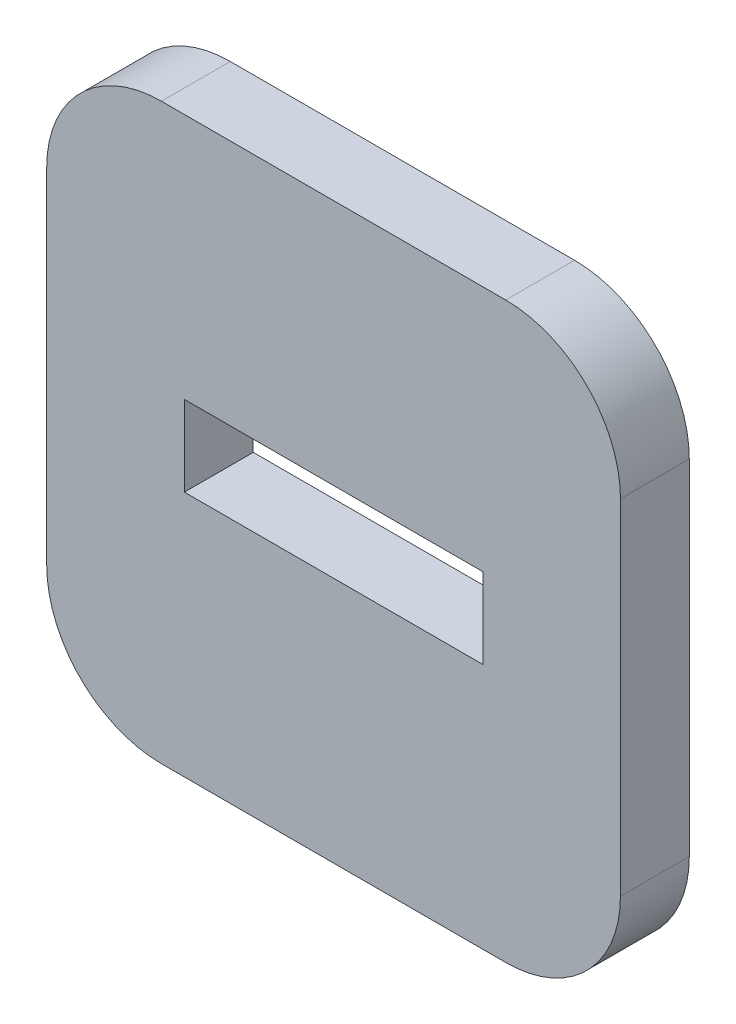
ISO-10303-21;
HEADER;
FILE_DESCRIPTION(('STEP AP214'),'2;1');
FILE_NAME('part.step','',(''),(''),'','','');
FILE_SCHEMA(('AUTOMOTIVE_DESIGN { 1 0 10303 214 1 1 1 1 }'));
ENDSEC;
DATA;
#1=APPLICATION_CONTEXT('core data for automotive mechanical design processes');
#2=APPLICATION_PROTOCOL_DEFINITION('international standard','automotive_design',2000,#1);
#3=PRODUCT_CONTEXT('',#1,'mechanical');
#4=PRODUCT('Part','Part','',(#3));
#5=PRODUCT_RELATED_PRODUCT_CATEGORY('part','',(#4));
#6=PRODUCT_DEFINITION_FORMATION('','',#4);
#7=PRODUCT_DEFINITION_CONTEXT('part definition',#1,'design');
#8=PRODUCT_DEFINITION('design','',#6,#7);
#9=PRODUCT_DEFINITION_SHAPE('','',#8);
#10=(LENGTH_UNIT() NAMED_UNIT(*) SI_UNIT(.MILLI.,.METRE.));
#11=(NAMED_UNIT(*) PLANE_ANGLE_UNIT() SI_UNIT($,.RADIAN.));
#12=(NAMED_UNIT(*) SI_UNIT($,.STERADIAN.) SOLID_ANGLE_UNIT());
#13=UNCERTAINTY_MEASURE_WITH_UNIT(LENGTH_MEASURE(1.E-05),#10,'distance_accuracy_value','');
#14=(GEOMETRIC_REPRESENTATION_CONTEXT(3) GLOBAL_UNCERTAINTY_ASSIGNED_CONTEXT((#13)) GLOBAL_UNIT_ASSIGNED_CONTEXT((#10,
#11,#12)) REPRESENTATION_CONTEXT('',''));
#15=CARTESIAN_POINT('',(0.,0.,0.));
#16=DIRECTION('',(0.,0.,1.));
#17=DIRECTION('',(1.,0.,0.));
#18=AXIS2_PLACEMENT_3D('',#15,#16,#17);
#19=CARTESIAN_POINT('',(-131.108892294877,-12.7,-3.048));
#20=DIRECTION('',(1.,0.,0.));
#21=DIRECTION('',(0.,0.,-1.));
#22=AXIS2_PLACEMENT_3D('',#19,#20,#21);
#23=PLANE('',#22);
#24=DIRECTION('',(0.,1.,0.));
#25=VECTOR('',#24,1.);
#26=CARTESIAN_POINT('',(-131.108892294877,-12.7,-3.048));
#27=LINE('',#26,#25);
#28=CARTESIAN_POINT('',(-131.108892294877,-7.62,-3.048));
#29=VERTEX_POINT('',#28);
#30=CARTESIAN_POINT('',(-131.108892294877,7.62,-3.048));
#31=VERTEX_POINT('',#30);
#32=EDGE_CURVE('E196',#29,#31,#27,.T.);
#33=ORIENTED_EDGE('',*,*,#32,.F.);
#34=DIRECTION('',(0.,0.,1.));
#35=VECTOR('',#34,1.);
#36=CARTESIAN_POINT('',(-131.108892294877,-7.62,0.));
#37=LINE('',#36,#35);
#38=CARTESIAN_POINT('',(-131.108892294877,-7.62,0.));
#39=VERTEX_POINT('',#38);
#40=EDGE_CURVE('E219',#29,#39,#37,.T.);
#41=ORIENTED_EDGE('',*,*,#40,.T.);
#42=DIRECTION('',(0.,1.,0.));
#43=VECTOR('',#42,1.);
#44=CARTESIAN_POINT('',(-131.108892294877,-12.7,0.));
#45=LINE('',#44,#43);
#46=CARTESIAN_POINT('',(-131.108892294877,7.62,0.));
#47=VERTEX_POINT('',#46);
#48=EDGE_CURVE('E192',#39,#47,#45,.T.);
#49=ORIENTED_EDGE('',*,*,#48,.T.);
#50=DIRECTION('',(0.,0.,1.));
#51=VECTOR('',#50,1.);
#52=CARTESIAN_POINT('',(-131.108892294877,7.62,-3.048));
#53=LINE('',#52,#51);
#54=EDGE_CURVE('E207',#47,#31,#53,.F.);
#55=ORIENTED_EDGE('',*,*,#54,.T.);
#56=EDGE_LOOP('',(#33,#41,#49,#55));
#57=FACE_BOUND('',#56,.T.);
#58=ADVANCED_FACE('F63',(#57),#23,.F.);
#59=CARTESIAN_POINT('',(-131.108892294877,12.7,-3.048));
#60=DIRECTION('',(0.,-1.,0.));
#61=DIRECTION('',(0.,0.,-1.));
#62=AXIS2_PLACEMENT_3D('',#59,#60,#61);
#63=PLANE('',#62);
#64=DIRECTION('',(1.,0.,0.));
#65=VECTOR('',#64,1.);
#66=CARTESIAN_POINT('',(-131.108892294877,12.7,0.));
#67=LINE('',#66,#65);
#68=CARTESIAN_POINT('',(-126.028892294877,12.7,0.));
#69=VERTEX_POINT('',#68);
#70=CARTESIAN_POINT('',(-110.788892294877,12.7,0.));
#71=VERTEX_POINT('',#70);
#72=EDGE_CURVE('E210',#69,#71,#67,.T.);
#73=ORIENTED_EDGE('',*,*,#72,.T.);
#74=DIRECTION('',(0.,0.,1.));
#75=VECTOR('',#74,1.);
#76=CARTESIAN_POINT('',(-110.788892294877,12.7,-3.048));
#77=LINE('',#76,#75);
#78=CARTESIAN_POINT('',(-110.788892294877,12.7,-3.048));
#79=VERTEX_POINT('',#78);
#80=EDGE_CURVE('E12',#71,#79,#77,.F.);
#81=ORIENTED_EDGE('',*,*,#80,.T.);
#82=DIRECTION('',(1.,0.,0.));
#83=VECTOR('',#82,1.);
#84=CARTESIAN_POINT('',(-131.108892294877,12.7,-3.048));
#85=LINE('',#84,#83);
#86=CARTESIAN_POINT('',(-126.028892294877,12.7,-3.048));
#87=VERTEX_POINT('',#86);
#88=EDGE_CURVE('E199',#87,#79,#85,.T.);
#89=ORIENTED_EDGE('',*,*,#88,.F.);
#90=DIRECTION('',(0.,0.,1.));
#91=VECTOR('',#90,1.);
#92=CARTESIAN_POINT('',(-126.028892294877,12.7,-3.048));
#93=LINE('',#92,#91);
#94=EDGE_CURVE('E71',#87,#69,#93,.T.);
#95=ORIENTED_EDGE('',*,*,#94,.T.);
#96=EDGE_LOOP('',(#73,#81,#89,#95));
#97=FACE_BOUND('',#96,.T.);
#98=ADVANCED_FACE('F250',(#97),#63,.F.);
#99=CARTESIAN_POINT('',(-105.708892294877,-12.7,-3.048));
#100=DIRECTION('',(1.,0.,0.));
#101=DIRECTION('',(0.,0.,-1.));
#102=AXIS2_PLACEMENT_3D('',#99,#100,#101);
#103=PLANE('',#102);
#104=DIRECTION('',(0.,1.,0.));
#105=VECTOR('',#104,1.);
#106=CARTESIAN_POINT('',(-105.708892294877,-12.7,0.));
#107=LINE('',#106,#105);
#108=CARTESIAN_POINT('',(-105.708892294877,-7.62,0.));
#109=VERTEX_POINT('',#108);
#110=CARTESIAN_POINT('',(-105.708892294877,7.61999999999999,0.));
#111=VERTEX_POINT('',#110);
#112=EDGE_CURVE('E213',#109,#111,#107,.T.);
#113=ORIENTED_EDGE('',*,*,#112,.F.);
#114=DIRECTION('',(0.,0.,1.));
#115=VECTOR('',#114,1.);
#116=CARTESIAN_POINT('',(-105.708892294877,-7.62,-3.048));
#117=LINE('',#116,#115);
#118=CARTESIAN_POINT('',(-105.708892294877,-7.62,-3.048));
#119=VERTEX_POINT('',#118);
#120=EDGE_CURVE('E85',#109,#119,#117,.F.);
#121=ORIENTED_EDGE('',*,*,#120,.T.);
#122=DIRECTION('',(0.,1.,0.));
#123=VECTOR('',#122,1.);
#124=CARTESIAN_POINT('',(-105.708892294877,-12.7,-3.048));
#125=LINE('',#124,#123);
#126=CARTESIAN_POINT('',(-105.708892294877,7.61999999999999,-3.048));
#127=VERTEX_POINT('',#126);
#128=EDGE_CURVE('E202',#119,#127,#125,.T.);
#129=ORIENTED_EDGE('',*,*,#128,.T.);
#130=DIRECTION('',(0.,0.,1.));
#131=VECTOR('',#130,1.);
#132=CARTESIAN_POINT('',(-105.708892294877,7.61999999999999,0.));
#133=LINE('',#132,#131);
#134=EDGE_CURVE('E242',#127,#111,#133,.T.);
#135=ORIENTED_EDGE('',*,*,#134,.T.);
#136=EDGE_LOOP('',(#113,#121,#129,#135));
#137=FACE_BOUND('',#136,.T.);
#138=ADVANCED_FACE('F260',(#137),#103,.T.);
#139=CARTESIAN_POINT('',(-131.108892294877,-12.7,-3.048));
#140=DIRECTION('',(0.,-1.,0.));
#141=DIRECTION('',(0.,0.,-1.));
#142=AXIS2_PLACEMENT_3D('',#139,#140,#141);
#143=PLANE('',#142);
#144=DIRECTION('',(1.,0.,0.));
#145=VECTOR('',#144,1.);
#146=CARTESIAN_POINT('',(-131.108892294877,-12.7,0.));
#147=LINE('',#146,#145);
#148=CARTESIAN_POINT('',(-126.028892294877,-12.7,0.));
#149=VERTEX_POINT('',#148);
#150=CARTESIAN_POINT('',(-110.788892294877,-12.7,0.));
#151=VERTEX_POINT('',#150);
#152=EDGE_CURVE('E200',#149,#151,#147,.T.);
#153=ORIENTED_EDGE('',*,*,#152,.F.);
#154=DIRECTION('',(0.,0.,1.));
#155=VECTOR('',#154,1.);
#156=CARTESIAN_POINT('',(-126.028892294877,-12.7,-3.048));
#157=LINE('',#156,#155);
#158=CARTESIAN_POINT('',(-126.028892294877,-12.7,-3.048));
#159=VERTEX_POINT('',#158);
#160=EDGE_CURVE('E233',#149,#159,#157,.F.);
#161=ORIENTED_EDGE('',*,*,#160,.T.);
#162=DIRECTION('',(1.,0.,0.));
#163=VECTOR('',#162,1.);
#164=CARTESIAN_POINT('',(-131.108892294877,-12.7,-3.048));
#165=LINE('',#164,#163);
#166=CARTESIAN_POINT('',(-110.788892294877,-12.7,-3.048));
#167=VERTEX_POINT('',#166);
#168=EDGE_CURVE('E204',#159,#167,#165,.T.);
#169=ORIENTED_EDGE('',*,*,#168,.T.);
#170=DIRECTION('',(0.,0.,1.));
#171=VECTOR('',#170,1.);
#172=CARTESIAN_POINT('',(-110.788892294877,-12.7,-3.048));
#173=LINE('',#172,#171);
#174=EDGE_CURVE('E230',#167,#151,#173,.T.);
#175=ORIENTED_EDGE('',*,*,#174,.T.);
#176=EDGE_LOOP('',(#153,#161,#169,#175));
#177=FACE_BOUND('',#176,.T.);
#178=ADVANCED_FACE('F268',(#177),#143,.T.);
#179=CARTESIAN_POINT('',(0.,0.,-3.048));
#180=DIRECTION('',(0.,0.,-1.));
#181=DIRECTION('',(-1.,0.,0.));
#182=AXIS2_PLACEMENT_3D('',#179,#180,#181);
#183=PLANE('',#182);
#184=DIRECTION('',(0.,1.,0.));
#185=VECTOR('',#184,1.);
#186=CARTESIAN_POINT('',(-111.804892294877,-1.778,-3.048));
#187=LINE('',#186,#185);
#188=CARTESIAN_POINT('',(-111.804892294877,-1.778,-3.048));
#189=VERTEX_POINT('',#188);
#190=CARTESIAN_POINT('',(-111.804892294877,1.778,-3.048));
#191=VERTEX_POINT('',#190);
#192=EDGE_CURVE('E157',#189,#191,#187,.T.);
#193=ORIENTED_EDGE('',*,*,#192,.T.);
#194=DIRECTION('',(-1.,0.,0.));
#195=VECTOR('',#194,1.);
#196=CARTESIAN_POINT('',(-111.804892294877,1.778,-3.048));
#197=LINE('',#196,#195);
#198=CARTESIAN_POINT('',(-125.012892294877,1.778,-3.048));
#199=VERTEX_POINT('',#198);
#200=EDGE_CURVE('E169',#191,#199,#197,.T.);
#201=ORIENTED_EDGE('',*,*,#200,.T.);
#202=DIRECTION('',(0.,-1.,0.));
#203=VECTOR('',#202,1.);
#204=CARTESIAN_POINT('',(-125.012892294877,1.778,-3.048));
#205=LINE('',#204,#203);
#206=CARTESIAN_POINT('',(-125.012892294877,-1.778,-3.048));
#207=VERTEX_POINT('',#206);
#208=EDGE_CURVE('E173',#199,#207,#205,.T.);
#209=ORIENTED_EDGE('',*,*,#208,.T.);
#210=DIRECTION('',(1.,0.,0.));
#211=VECTOR('',#210,1.);
#212=CARTESIAN_POINT('',(-125.012892294877,-1.778,-3.048));
#213=LINE('',#212,#211);
#214=EDGE_CURVE('E165',#207,#189,#213,.T.);
#215=ORIENTED_EDGE('',*,*,#214,.T.);
#216=EDGE_LOOP('',(#193,#201,#209,#215));
#217=FACE_BOUND('',#216,.T.);
#218=ORIENTED_EDGE('',*,*,#168,.F.);
#219=CARTESIAN_POINT('',(-126.028892294877,-7.62,-3.048));
#220=DIRECTION('',(0.,0.,-1.));
#221=DIRECTION('',(-1.,0.,0.));
#222=AXIS2_PLACEMENT_3D('',#219,#220,#221);
#223=CIRCLE('',#222,5.08);
#224=EDGE_CURVE('E240',#159,#29,#223,.T.);
#225=ORIENTED_EDGE('',*,*,#224,.T.);
#226=ORIENTED_EDGE('',*,*,#32,.T.);
#227=CARTESIAN_POINT('',(-126.028892294877,7.62,-3.048));
#228=DIRECTION('',(0.,0.,-1.));
#229=DIRECTION('',(-1.,0.,0.));
#230=AXIS2_PLACEMENT_3D('',#227,#228,#229);
#231=CIRCLE('',#230,5.08);
#232=EDGE_CURVE('E235',#31,#87,#231,.T.);
#233=ORIENTED_EDGE('',*,*,#232,.T.);
#234=ORIENTED_EDGE('',*,*,#88,.T.);
#235=CARTESIAN_POINT('',(-110.788892294877,7.61999999999999,-3.048));
#236=DIRECTION('',(0.,0.,-1.));
#237=DIRECTION('',(-1.,0.,0.));
#238=AXIS2_PLACEMENT_3D('',#235,#236,#237);
#239=CIRCLE('',#238,5.08);
#240=EDGE_CURVE('E78',#79,#127,#239,.T.);
#241=ORIENTED_EDGE('',*,*,#240,.T.);
#242=ORIENTED_EDGE('',*,*,#128,.F.);
#243=CARTESIAN_POINT('',(-110.788892294877,-7.62,-3.048));
#244=DIRECTION('',(0.,0.,-1.));
#245=DIRECTION('',(-1.,0.,0.));
#246=AXIS2_PLACEMENT_3D('',#243,#244,#245);
#247=CIRCLE('',#246,5.08);
#248=EDGE_CURVE('E238',#119,#167,#247,.T.);
#249=ORIENTED_EDGE('',*,*,#248,.T.);
#250=EDGE_LOOP('',(#218,#225,#226,#233,#234,#241,#242,#249));
#251=FACE_BOUND('',#250,.T.);
#252=ADVANCED_FACE('F175',(#217,#251),#183,.T.);
#253=CARTESIAN_POINT('',(0.,0.,0.));
#254=DIRECTION('',(0.,0.,-1.));
#255=DIRECTION('',(-1.,0.,0.));
#256=AXIS2_PLACEMENT_3D('',#253,#254,#255);
#257=PLANE('',#256);
#258=DIRECTION('',(-1.,0.,0.));
#259=VECTOR('',#258,1.);
#260=CARTESIAN_POINT('',(-111.804892294877,1.778,0.));
#261=LINE('',#260,#259);
#262=CARTESIAN_POINT('',(-111.804892294877,1.778,0.));
#263=VERTEX_POINT('',#262);
#264=CARTESIAN_POINT('',(-125.012892294877,1.778,0.));
#265=VERTEX_POINT('',#264);
#266=EDGE_CURVE('E186',#263,#265,#261,.T.);
#267=ORIENTED_EDGE('',*,*,#266,.F.);
#268=DIRECTION('',(0.,1.,0.));
#269=VECTOR('',#268,1.);
#270=CARTESIAN_POINT('',(-111.804892294877,-1.778,0.));
#271=LINE('',#270,#269);
#272=CARTESIAN_POINT('',(-111.804892294877,-1.778,0.));
#273=VERTEX_POINT('',#272);
#274=EDGE_CURVE('E160',#273,#263,#271,.T.);
#275=ORIENTED_EDGE('',*,*,#274,.F.);
#276=DIRECTION('',(1.,0.,0.));
#277=VECTOR('',#276,1.);
#278=CARTESIAN_POINT('',(-125.012892294877,-1.778,0.));
#279=LINE('',#278,#277);
#280=CARTESIAN_POINT('',(-125.012892294877,-1.778,0.));
#281=VERTEX_POINT('',#280);
#282=EDGE_CURVE('E177',#281,#273,#279,.T.);
#283=ORIENTED_EDGE('',*,*,#282,.F.);
#284=DIRECTION('',(0.,-1.,0.));
#285=VECTOR('',#284,1.);
#286=CARTESIAN_POINT('',(-125.012892294877,1.778,0.));
#287=LINE('',#286,#285);
#288=EDGE_CURVE('E180',#265,#281,#287,.T.);
#289=ORIENTED_EDGE('',*,*,#288,.F.);
#290=EDGE_LOOP('',(#267,#275,#283,#289));
#291=FACE_BOUND('',#290,.T.);
#292=ORIENTED_EDGE('',*,*,#48,.F.);
#293=CARTESIAN_POINT('',(-126.028892294877,-7.62,0.));
#294=DIRECTION('',(0.,0.,-1.));
#295=DIRECTION('',(-1.,0.,0.));
#296=AXIS2_PLACEMENT_3D('',#293,#294,#295);
#297=CIRCLE('',#296,5.08);
#298=EDGE_CURVE('E228',#39,#149,#297,.F.);
#299=ORIENTED_EDGE('',*,*,#298,.T.);
#300=ORIENTED_EDGE('',*,*,#152,.T.);
#301=CARTESIAN_POINT('',(-110.788892294877,-7.62,0.));
#302=DIRECTION('',(0.,0.,-1.));
#303=DIRECTION('',(-1.,0.,0.));
#304=AXIS2_PLACEMENT_3D('',#301,#302,#303);
#305=CIRCLE('',#304,5.08);
#306=EDGE_CURVE('E226',#151,#109,#305,.F.);
#307=ORIENTED_EDGE('',*,*,#306,.T.);
#308=ORIENTED_EDGE('',*,*,#112,.T.);
#309=CARTESIAN_POINT('',(-110.788892294877,7.61999999999999,0.));
#310=DIRECTION('',(0.,0.,-1.));
#311=DIRECTION('',(-1.,0.,0.));
#312=AXIS2_PLACEMENT_3D('',#309,#310,#311);
#313=CIRCLE('',#312,5.08);
#314=EDGE_CURVE('E224',#111,#71,#313,.F.);
#315=ORIENTED_EDGE('',*,*,#314,.T.);
#316=ORIENTED_EDGE('',*,*,#72,.F.);
#317=CARTESIAN_POINT('',(-126.028892294877,7.62,0.));
#318=DIRECTION('',(0.,0.,-1.));
#319=DIRECTION('',(-1.,0.,0.));
#320=AXIS2_PLACEMENT_3D('',#317,#318,#319);
#321=CIRCLE('',#320,5.08);
#322=EDGE_CURVE('E222',#69,#47,#321,.F.);
#323=ORIENTED_EDGE('',*,*,#322,.T.);
#324=EDGE_LOOP('',(#292,#299,#300,#307,#308,#315,#316,#323));
#325=FACE_BOUND('',#324,.T.);
#326=ADVANCED_FACE('F256',(#291,#325),#257,.F.);
#327=CARTESIAN_POINT('',(-111.804892294877,-1.778,-3.048));
#328=DIRECTION('',(1.,0.,0.));
#329=DIRECTION('',(0.,0.,-1.));
#330=AXIS2_PLACEMENT_3D('',#327,#328,#329);
#331=PLANE('',#330);
#332=ORIENTED_EDGE('',*,*,#274,.T.);
#333=DIRECTION('',(0.,0.,1.));
#334=VECTOR('',#333,1.);
#335=CARTESIAN_POINT('',(-111.804892294877,1.778,-3.048));
#336=LINE('',#335,#334);
#337=EDGE_CURVE('E153',#191,#263,#336,.T.);
#338=ORIENTED_EDGE('',*,*,#337,.F.);
#339=ORIENTED_EDGE('',*,*,#192,.F.);
#340=DIRECTION('',(0.,0.,1.));
#341=VECTOR('',#340,1.);
#342=CARTESIAN_POINT('',(-111.804892294877,-1.778,-3.048));
#343=LINE('',#342,#341);
#344=EDGE_CURVE('E190',#189,#273,#343,.T.);
#345=ORIENTED_EDGE('',*,*,#344,.T.);
#346=EDGE_LOOP('',(#332,#338,#339,#345));
#347=FACE_BOUND('',#346,.T.);
#348=ADVANCED_FACE('F155',(#347),#331,.F.);
#349=CARTESIAN_POINT('',(-125.012892294877,-1.778,-3.048));
#350=DIRECTION('',(0.,-1.,0.));
#351=DIRECTION('',(0.,0.,-1.));
#352=AXIS2_PLACEMENT_3D('',#349,#350,#351);
#353=PLANE('',#352);
#354=ORIENTED_EDGE('',*,*,#282,.T.);
#355=ORIENTED_EDGE('',*,*,#344,.F.);
#356=ORIENTED_EDGE('',*,*,#214,.F.);
#357=DIRECTION('',(0.,0.,1.));
#358=VECTOR('',#357,1.);
#359=CARTESIAN_POINT('',(-125.012892294877,-1.778,-3.048));
#360=LINE('',#359,#358);
#361=EDGE_CURVE('E193',#207,#281,#360,.T.);
#362=ORIENTED_EDGE('',*,*,#361,.T.);
#363=EDGE_LOOP('',(#354,#355,#356,#362));
#364=FACE_BOUND('',#363,.T.);
#365=ADVANCED_FACE('F328',(#364),#353,.F.);
#366=CARTESIAN_POINT('',(-125.012892294877,1.778,-3.048));
#367=DIRECTION('',(-1.,0.,0.));
#368=DIRECTION('',(0.,0.,1.));
#369=AXIS2_PLACEMENT_3D('',#366,#367,#368);
#370=PLANE('',#369);
#371=ORIENTED_EDGE('',*,*,#288,.T.);
#372=ORIENTED_EDGE('',*,*,#361,.F.);
#373=ORIENTED_EDGE('',*,*,#208,.F.);
#374=DIRECTION('',(0.,0.,1.));
#375=VECTOR('',#374,1.);
#376=CARTESIAN_POINT('',(-125.012892294877,1.778,-3.048));
#377=LINE('',#376,#375);
#378=EDGE_CURVE('E164',#199,#265,#377,.T.);
#379=ORIENTED_EDGE('',*,*,#378,.T.);
#380=EDGE_LOOP('',(#371,#372,#373,#379));
#381=FACE_BOUND('',#380,.T.);
#382=ADVANCED_FACE('F320',(#381),#370,.F.);
#383=CARTESIAN_POINT('',(-111.804892294877,1.778,-3.048));
#384=DIRECTION('',(0.,1.,0.));
#385=DIRECTION('',(0.,0.,1.));
#386=AXIS2_PLACEMENT_3D('',#383,#384,#385);
#387=PLANE('',#386);
#388=ORIENTED_EDGE('',*,*,#266,.T.);
#389=ORIENTED_EDGE('',*,*,#378,.F.);
#390=ORIENTED_EDGE('',*,*,#200,.F.);
#391=ORIENTED_EDGE('',*,*,#337,.T.);
#392=EDGE_LOOP('',(#388,#389,#390,#391));
#393=FACE_BOUND('',#392,.T.);
#394=ADVANCED_FACE('F170',(#393),#387,.F.);
#395=CARTESIAN_POINT('',(-126.028892294877,-7.62,-3.048));
#396=DIRECTION('',(0.,0.,-1.));
#397=DIRECTION('',(-1.,0.,0.));
#398=AXIS2_PLACEMENT_3D('',#395,#396,#397);
#399=CYLINDRICAL_SURFACE('',#398,5.08);
#400=ORIENTED_EDGE('',*,*,#224,.F.);
#401=ORIENTED_EDGE('',*,*,#160,.F.);
#402=ORIENTED_EDGE('',*,*,#298,.F.);
#403=ORIENTED_EDGE('',*,*,#40,.F.);
#404=EDGE_LOOP('',(#400,#401,#402,#403));
#405=FACE_BOUND('',#404,.T.);
#406=ADVANCED_FACE('F273',(#405),#399,.T.);
#407=CARTESIAN_POINT('',(-110.788892294877,-7.62,-3.048));
#408=DIRECTION('',(0.,0.,1.));
#409=DIRECTION('',(1.,0.,0.));
#410=AXIS2_PLACEMENT_3D('',#407,#408,#409);
#411=CYLINDRICAL_SURFACE('',#410,5.08);
#412=ORIENTED_EDGE('',*,*,#248,.F.);
#413=ORIENTED_EDGE('',*,*,#120,.F.);
#414=ORIENTED_EDGE('',*,*,#306,.F.);
#415=ORIENTED_EDGE('',*,*,#174,.F.);
#416=EDGE_LOOP('',(#412,#413,#414,#415));
#417=FACE_BOUND('',#416,.T.);
#418=ADVANCED_FACE('F265',(#417),#411,.T.);
#419=CARTESIAN_POINT('',(-110.788892294877,7.61999999999999,-3.048));
#420=DIRECTION('',(0.,0.,-1.));
#421=DIRECTION('',(-1.,0.,0.));
#422=AXIS2_PLACEMENT_3D('',#419,#420,#421);
#423=CYLINDRICAL_SURFACE('',#422,5.08);
#424=ORIENTED_EDGE('',*,*,#240,.F.);
#425=ORIENTED_EDGE('',*,*,#80,.F.);
#426=ORIENTED_EDGE('',*,*,#314,.F.);
#427=ORIENTED_EDGE('',*,*,#134,.F.);
#428=EDGE_LOOP('',(#424,#425,#426,#427));
#429=FACE_BOUND('',#428,.T.);
#430=ADVANCED_FACE('F259',(#429),#423,.T.);
#431=CARTESIAN_POINT('',(-126.028892294877,7.62,-3.048));
#432=DIRECTION('',(0.,0.,1.));
#433=DIRECTION('',(1.,0.,0.));
#434=AXIS2_PLACEMENT_3D('',#431,#432,#433);
#435=CYLINDRICAL_SURFACE('',#434,5.08);
#436=ORIENTED_EDGE('',*,*,#232,.F.);
#437=ORIENTED_EDGE('',*,*,#54,.F.);
#438=ORIENTED_EDGE('',*,*,#322,.F.);
#439=ORIENTED_EDGE('',*,*,#94,.F.);
#440=EDGE_LOOP('',(#436,#437,#438,#439));
#441=FACE_BOUND('',#440,.T.);
#442=ADVANCED_FACE('F65',(#441),#435,.T.);
#443=CLOSED_SHELL('',(#58,#98,#138,#178,#252,#326,#348,#365,#382,#394,#406,#418,#430,#442));
#444=MANIFOLD_SOLID_BREP('B2',#443);
#445=ADVANCED_BREP_SHAPE_REPRESENTATION('',(#18,#444),#14);
#446=SHAPE_DEFINITION_REPRESENTATION(#9,#445);
ENDSEC;
END-ISO-10303-21;
